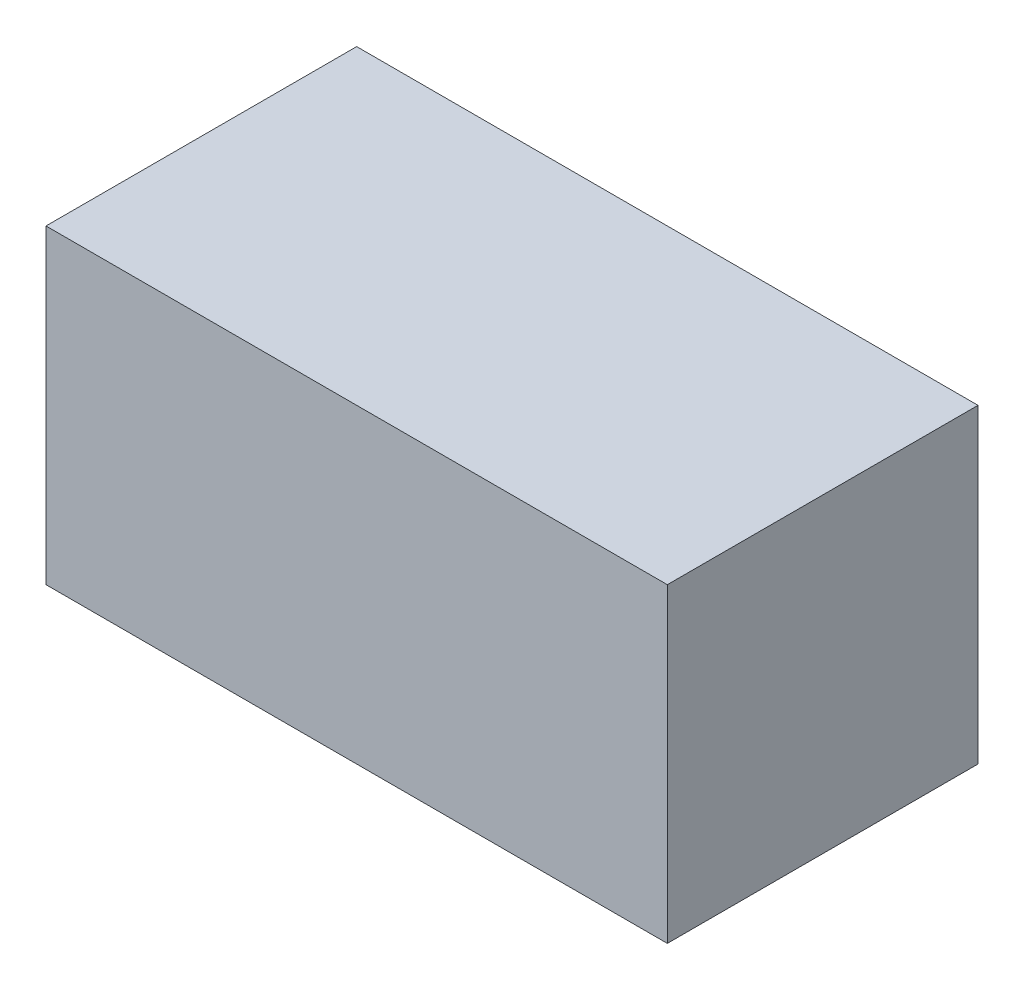
ISO-10303-21;
HEADER;
FILE_DESCRIPTION(('STEP AP214'),'2;1');
FILE_NAME('part.step','',(''),(''),'','','');
FILE_SCHEMA(('AUTOMOTIVE_DESIGN { 1 0 10303 214 1 1 1 1 }'));
ENDSEC;
DATA;
#1=APPLICATION_CONTEXT('core data for automotive mechanical design processes');
#2=APPLICATION_PROTOCOL_DEFINITION('international standard','automotive_design',2000,#1);
#3=PRODUCT_CONTEXT('',#1,'mechanical');
#4=PRODUCT('Part','Part','',(#3));
#5=PRODUCT_RELATED_PRODUCT_CATEGORY('part','',(#4));
#6=PRODUCT_DEFINITION_FORMATION('','',#4);
#7=PRODUCT_DEFINITION_CONTEXT('part definition',#1,'design');
#8=PRODUCT_DEFINITION('design','',#6,#7);
#9=PRODUCT_DEFINITION_SHAPE('','',#8);
#10=(LENGTH_UNIT() NAMED_UNIT(*) SI_UNIT(.MILLI.,.METRE.));
#11=(NAMED_UNIT(*) PLANE_ANGLE_UNIT() SI_UNIT($,.RADIAN.));
#12=(NAMED_UNIT(*) SI_UNIT($,.STERADIAN.) SOLID_ANGLE_UNIT());
#13=UNCERTAINTY_MEASURE_WITH_UNIT(LENGTH_MEASURE(1.E-05),#10,'distance_accuracy_value','');
#14=(GEOMETRIC_REPRESENTATION_CONTEXT(3) GLOBAL_UNCERTAINTY_ASSIGNED_CONTEXT((#13)) GLOBAL_UNIT_ASSIGNED_CONTEXT((#10,
#11,#12)) REPRESENTATION_CONTEXT('',''));
#15=CARTESIAN_POINT('',(0.,0.,0.));
#16=DIRECTION('',(0.,0.,1.));
#17=DIRECTION('',(1.,0.,0.));
#18=AXIS2_PLACEMENT_3D('',#15,#16,#17);
#19=CARTESIAN_POINT('',(0.,0.,4.75));
#20=DIRECTION('',(1.,0.,0.));
#21=DIRECTION('',(0.,0.,-1.));
#22=AXIS2_PLACEMENT_3D('',#19,#20,#21);
#23=PLANE('',#22);
#24=DIRECTION('',(0.,-1.,0.));
#25=VECTOR('',#24,1.);
#26=CARTESIAN_POINT('',(0.,0.,0.));
#27=LINE('',#26,#25);
#28=CARTESIAN_POINT('',(0.,4.75,0.));
#29=VERTEX_POINT('',#28);
#30=CARTESIAN_POINT('',(0.,0.,0.));
#31=VERTEX_POINT('',#30);
#32=EDGE_CURVE('E99',#29,#31,#27,.T.);
#33=ORIENTED_EDGE('',*,*,#32,.T.);
#34=DIRECTION('',(0.,0.,-1.));
#35=VECTOR('',#34,1.);
#36=CARTESIAN_POINT('',(0.,0.,4.75));
#37=LINE('',#36,#35);
#38=CARTESIAN_POINT('',(0.,0.,4.75));
#39=VERTEX_POINT('',#38);
#40=EDGE_CURVE('E11',#39,#31,#37,.T.);
#41=ORIENTED_EDGE('',*,*,#40,.F.);
#42=DIRECTION('',(0.,-1.,0.));
#43=VECTOR('',#42,1.);
#44=CARTESIAN_POINT('',(0.,0.,4.75));
#45=LINE('',#44,#43);
#46=CARTESIAN_POINT('',(0.,4.75,4.75));
#47=VERTEX_POINT('',#46);
#48=EDGE_CURVE('E87',#47,#39,#45,.T.);
#49=ORIENTED_EDGE('',*,*,#48,.F.);
#50=DIRECTION('',(0.,0.,-1.));
#51=VECTOR('',#50,1.);
#52=CARTESIAN_POINT('',(0.,4.75,4.75));
#53=LINE('',#52,#51);
#54=EDGE_CURVE('E95',#47,#29,#53,.T.);
#55=ORIENTED_EDGE('',*,*,#54,.T.);
#56=EDGE_LOOP('',(#33,#41,#49,#55));
#57=FACE_BOUND('',#56,.T.);
#58=ADVANCED_FACE('F36',(#57),#23,.F.);
#59=CARTESIAN_POINT('',(0.,0.,4.75));
#60=DIRECTION('',(0.,1.,0.));
#61=DIRECTION('',(0.,0.,1.));
#62=AXIS2_PLACEMENT_3D('',#59,#60,#61);
#63=PLANE('',#62);
#64=DIRECTION('',(1.,0.,0.));
#65=VECTOR('',#64,1.);
#66=CARTESIAN_POINT('',(0.,0.,0.));
#67=LINE('',#66,#65);
#68=CARTESIAN_POINT('',(9.5,0.,0.));
#69=VERTEX_POINT('',#68);
#70=EDGE_CURVE('E91',#31,#69,#67,.T.);
#71=ORIENTED_EDGE('',*,*,#70,.T.);
#72=DIRECTION('',(0.,0.,-1.));
#73=VECTOR('',#72,1.);
#74=CARTESIAN_POINT('',(9.5,0.,4.75));
#75=LINE('',#74,#73);
#76=CARTESIAN_POINT('',(9.5,0.,4.75));
#77=VERTEX_POINT('',#76);
#78=EDGE_CURVE('E44',#77,#69,#75,.T.);
#79=ORIENTED_EDGE('',*,*,#78,.F.);
#80=DIRECTION('',(1.,0.,0.));
#81=VECTOR('',#80,1.);
#82=CARTESIAN_POINT('',(0.,0.,4.75));
#83=LINE('',#82,#81);
#84=EDGE_CURVE('E82',#39,#77,#83,.T.);
#85=ORIENTED_EDGE('',*,*,#84,.F.);
#86=ORIENTED_EDGE('',*,*,#40,.T.);
#87=EDGE_LOOP('',(#71,#79,#85,#86));
#88=FACE_BOUND('',#87,.T.);
#89=ADVANCED_FACE('F90',(#88),#63,.F.);
#90=CARTESIAN_POINT('',(9.5,0.,4.75));
#91=DIRECTION('',(-1.,0.,0.));
#92=DIRECTION('',(0.,-1.,0.));
#93=AXIS2_PLACEMENT_3D('',#90,#91,#92);
#94=PLANE('',#93);
#95=DIRECTION('',(0.,1.,0.));
#96=VECTOR('',#95,1.);
#97=CARTESIAN_POINT('',(9.5,0.,0.));
#98=LINE('',#97,#96);
#99=CARTESIAN_POINT('',(9.5,4.75,0.));
#100=VERTEX_POINT('',#99);
#101=EDGE_CURVE('E69',#69,#100,#98,.T.);
#102=ORIENTED_EDGE('',*,*,#101,.T.);
#103=DIRECTION('',(0.,0.,-1.));
#104=VECTOR('',#103,1.);
#105=CARTESIAN_POINT('',(9.5,4.75,4.75));
#106=LINE('',#105,#104);
#107=CARTESIAN_POINT('',(9.5,4.75,4.75));
#108=VERTEX_POINT('',#107);
#109=EDGE_CURVE('E92',#108,#100,#106,.T.);
#110=ORIENTED_EDGE('',*,*,#109,.F.);
#111=DIRECTION('',(0.,1.,0.));
#112=VECTOR('',#111,1.);
#113=CARTESIAN_POINT('',(9.5,0.,4.75));
#114=LINE('',#113,#112);
#115=EDGE_CURVE('E85',#77,#108,#114,.T.);
#116=ORIENTED_EDGE('',*,*,#115,.F.);
#117=ORIENTED_EDGE('',*,*,#78,.T.);
#118=EDGE_LOOP('',(#102,#110,#116,#117));
#119=FACE_BOUND('',#118,.T.);
#120=ADVANCED_FACE('F93',(#119),#94,.F.);
#121=CARTESIAN_POINT('',(0.,4.75,4.75));
#122=DIRECTION('',(0.,-1.,0.));
#123=DIRECTION('',(0.,0.,-1.));
#124=AXIS2_PLACEMENT_3D('',#121,#122,#123);
#125=PLANE('',#124);
#126=DIRECTION('',(-1.,0.,0.));
#127=VECTOR('',#126,1.);
#128=CARTESIAN_POINT('',(0.,4.75,0.));
#129=LINE('',#128,#127);
#130=EDGE_CURVE('E75',#100,#29,#129,.T.);
#131=ORIENTED_EDGE('',*,*,#130,.T.);
#132=ORIENTED_EDGE('',*,*,#54,.F.);
#133=DIRECTION('',(-1.,0.,0.));
#134=VECTOR('',#133,1.);
#135=CARTESIAN_POINT('',(0.,4.75,4.75));
#136=LINE('',#135,#134);
#137=EDGE_CURVE('E52',#108,#47,#136,.T.);
#138=ORIENTED_EDGE('',*,*,#137,.F.);
#139=ORIENTED_EDGE('',*,*,#109,.T.);
#140=EDGE_LOOP('',(#131,#132,#138,#139));
#141=FACE_BOUND('',#140,.T.);
#142=ADVANCED_FACE('F106',(#141),#125,.F.);
#143=CARTESIAN_POINT('',(0.,0.,4.75));
#144=DIRECTION('',(0.,0.,-1.));
#145=DIRECTION('',(-1.,0.,0.));
#146=AXIS2_PLACEMENT_3D('',#143,#144,#145);
#147=PLANE('',#146);
#148=ORIENTED_EDGE('',*,*,#48,.T.);
#149=ORIENTED_EDGE('',*,*,#84,.T.);
#150=ORIENTED_EDGE('',*,*,#115,.T.);
#151=ORIENTED_EDGE('',*,*,#137,.T.);
#152=EDGE_LOOP('',(#148,#149,#150,#151));
#153=FACE_BOUND('',#152,.T.);
#154=ADVANCED_FACE('F83',(#153),#147,.F.);
#155=CARTESIAN_POINT('',(0.,0.,0.));
#156=DIRECTION('',(0.,0.,-1.));
#157=DIRECTION('',(-1.,0.,0.));
#158=AXIS2_PLACEMENT_3D('',#155,#156,#157);
#159=PLANE('',#158);
#160=ORIENTED_EDGE('',*,*,#32,.F.);
#161=ORIENTED_EDGE('',*,*,#130,.F.);
#162=ORIENTED_EDGE('',*,*,#101,.F.);
#163=ORIENTED_EDGE('',*,*,#70,.F.);
#164=EDGE_LOOP('',(#160,#161,#162,#163));
#165=FACE_BOUND('',#164,.T.);
#166=ADVANCED_FACE('F109',(#165),#159,.T.);
#167=CLOSED_SHELL('',(#58,#89,#120,#142,#154,#166));
#168=MANIFOLD_SOLID_BREP('B2',#167);
#169=ADVANCED_BREP_SHAPE_REPRESENTATION('',(#18,#168),#14);
#170=SHAPE_DEFINITION_REPRESENTATION(#9,#169);
ENDSEC;
END-ISO-10303-21;
